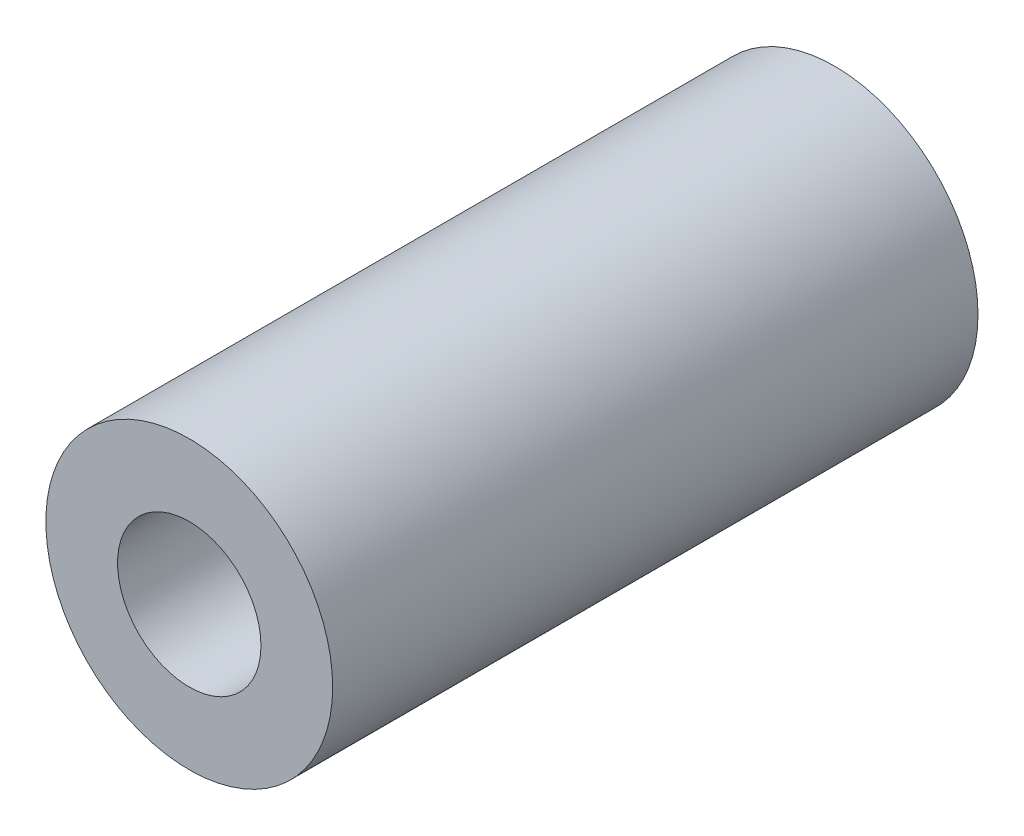
ISO-10303-21;
HEADER;
FILE_DESCRIPTION(('STEP AP214'),'2;1');
FILE_NAME('part.step','',(''),(''),'','','');
FILE_SCHEMA(('AUTOMOTIVE_DESIGN { 1 0 10303 214 1 1 1 1 }'));
ENDSEC;
DATA;
#1=APPLICATION_CONTEXT('core data for automotive mechanical design processes');
#2=APPLICATION_PROTOCOL_DEFINITION('international standard','automotive_design',2000,#1);
#3=PRODUCT_CONTEXT('',#1,'mechanical');
#4=PRODUCT('Part','Part','',(#3));
#5=PRODUCT_RELATED_PRODUCT_CATEGORY('part','',(#4));
#6=PRODUCT_DEFINITION_FORMATION('','',#4);
#7=PRODUCT_DEFINITION_CONTEXT('part definition',#1,'design');
#8=PRODUCT_DEFINITION('design','',#6,#7);
#9=PRODUCT_DEFINITION_SHAPE('','',#8);
#10=(LENGTH_UNIT() NAMED_UNIT(*) SI_UNIT(.MILLI.,.METRE.));
#11=(NAMED_UNIT(*) PLANE_ANGLE_UNIT() SI_UNIT($,.RADIAN.));
#12=(NAMED_UNIT(*) SI_UNIT($,.STERADIAN.) SOLID_ANGLE_UNIT());
#13=UNCERTAINTY_MEASURE_WITH_UNIT(LENGTH_MEASURE(1.E-05),#10,'distance_accuracy_value','');
#14=(GEOMETRIC_REPRESENTATION_CONTEXT(3) GLOBAL_UNCERTAINTY_ASSIGNED_CONTEXT((#13)) GLOBAL_UNIT_ASSIGNED_CONTEXT((#10,
#11,#12)) REPRESENTATION_CONTEXT('',''));
#15=CARTESIAN_POINT('',(0.,0.,0.));
#16=DIRECTION('',(0.,0.,1.));
#17=DIRECTION('',(1.,0.,0.));
#18=AXIS2_PLACEMENT_3D('',#15,#16,#17);
#19=CARTESIAN_POINT('',(0.,0.,18.));
#20=DIRECTION('',(0.,0.,1.));
#21=DIRECTION('',(1.,0.,0.));
#22=AXIS2_PLACEMENT_3D('',#19,#20,#21);
#23=PLANE('',#22);
#24=CARTESIAN_POINT('',(0.,0.,18.));
#25=DIRECTION('',(0.,0.,1.));
#26=DIRECTION('',(1.,0.,0.));
#27=AXIS2_PLACEMENT_3D('',#24,#25,#26);
#28=CIRCLE('',#27,4.);
#29=CARTESIAN_POINT('',(4.,0.,18.));
#30=VERTEX_POINT('',#29);
#31=EDGE_CURVE('E10',#30,#30,#28,.T.);
#32=ORIENTED_EDGE('',*,*,#31,.T.);
#33=EDGE_LOOP('',(#32));
#34=FACE_BOUND('',#33,.T.);
#35=CARTESIAN_POINT('',(0.,0.,18.));
#36=DIRECTION('',(0.,0.,1.));
#37=DIRECTION('',(1.,0.,0.));
#38=AXIS2_PLACEMENT_3D('',#35,#36,#37);
#39=CIRCLE('',#38,2.);
#40=CARTESIAN_POINT('',(2.,0.,18.));
#41=VERTEX_POINT('',#40);
#42=EDGE_CURVE('E54',#41,#41,#39,.T.);
#43=ORIENTED_EDGE('',*,*,#42,.F.);
#44=EDGE_LOOP('',(#43));
#45=FACE_BOUND('',#44,.T.);
#46=ADVANCED_FACE('F41',(#34,#45),#23,.T.);
#47=CARTESIAN_POINT('',(0.,0.,0.));
#48=DIRECTION('',(0.,0.,1.));
#49=DIRECTION('',(1.,0.,0.));
#50=AXIS2_PLACEMENT_3D('',#47,#48,#49);
#51=PLANE('',#50);
#52=CARTESIAN_POINT('',(0.,0.,0.));
#53=DIRECTION('',(0.,0.,1.));
#54=DIRECTION('',(1.,0.,0.));
#55=AXIS2_PLACEMENT_3D('',#52,#53,#54);
#56=CIRCLE('',#55,4.);
#57=CARTESIAN_POINT('',(4.,0.,0.));
#58=VERTEX_POINT('',#57);
#59=EDGE_CURVE('E45',#58,#58,#56,.T.);
#60=ORIENTED_EDGE('',*,*,#59,.F.);
#61=EDGE_LOOP('',(#60));
#62=FACE_BOUND('',#61,.T.);
#63=CARTESIAN_POINT('',(0.,0.,0.));
#64=DIRECTION('',(0.,0.,1.));
#65=DIRECTION('',(1.,0.,0.));
#66=AXIS2_PLACEMENT_3D('',#63,#64,#65);
#67=CIRCLE('',#66,2.);
#68=CARTESIAN_POINT('',(2.,0.,0.));
#69=VERTEX_POINT('',#68);
#70=EDGE_CURVE('E56',#69,#69,#67,.T.);
#71=ORIENTED_EDGE('',*,*,#70,.T.);
#72=EDGE_LOOP('',(#71));
#73=FACE_BOUND('',#72,.T.);
#74=ADVANCED_FACE('F68',(#62,#73),#51,.F.);
#75=CARTESIAN_POINT('',(0.,0.,18.));
#76=DIRECTION('',(0.,0.,-1.));
#77=DIRECTION('',(-1.,0.,0.));
#78=AXIS2_PLACEMENT_3D('',#75,#76,#77);
#79=CYLINDRICAL_SURFACE('',#78,4.);
#80=ORIENTED_EDGE('',*,*,#31,.F.);
#81=EDGE_LOOP('',(#80));
#82=FACE_BOUND('',#81,.T.);
#83=ORIENTED_EDGE('',*,*,#59,.T.);
#84=EDGE_LOOP('',(#83));
#85=FACE_BOUND('',#84,.T.);
#86=ADVANCED_FACE('F43',(#82,#85),#79,.T.);
#87=CARTESIAN_POINT('',(0.,0.,18.));
#88=DIRECTION('',(0.,0.,-1.));
#89=DIRECTION('',(-1.,0.,0.));
#90=AXIS2_PLACEMENT_3D('',#87,#88,#89);
#91=CYLINDRICAL_SURFACE('',#90,2.);
#92=ORIENTED_EDGE('',*,*,#42,.T.);
#93=EDGE_LOOP('',(#92));
#94=FACE_BOUND('',#93,.T.);
#95=ORIENTED_EDGE('',*,*,#70,.F.);
#96=EDGE_LOOP('',(#95));
#97=FACE_BOUND('',#96,.T.);
#98=ADVANCED_FACE('F64',(#94,#97),#91,.F.);
#99=CLOSED_SHELL('',(#46,#74,#86,#98));
#100=MANIFOLD_SOLID_BREP('B2',#99);
#101=ADVANCED_BREP_SHAPE_REPRESENTATION('',(#18,#100),#14);
#102=SHAPE_DEFINITION_REPRESENTATION(#9,#101);
ENDSEC;
END-ISO-10303-21;
